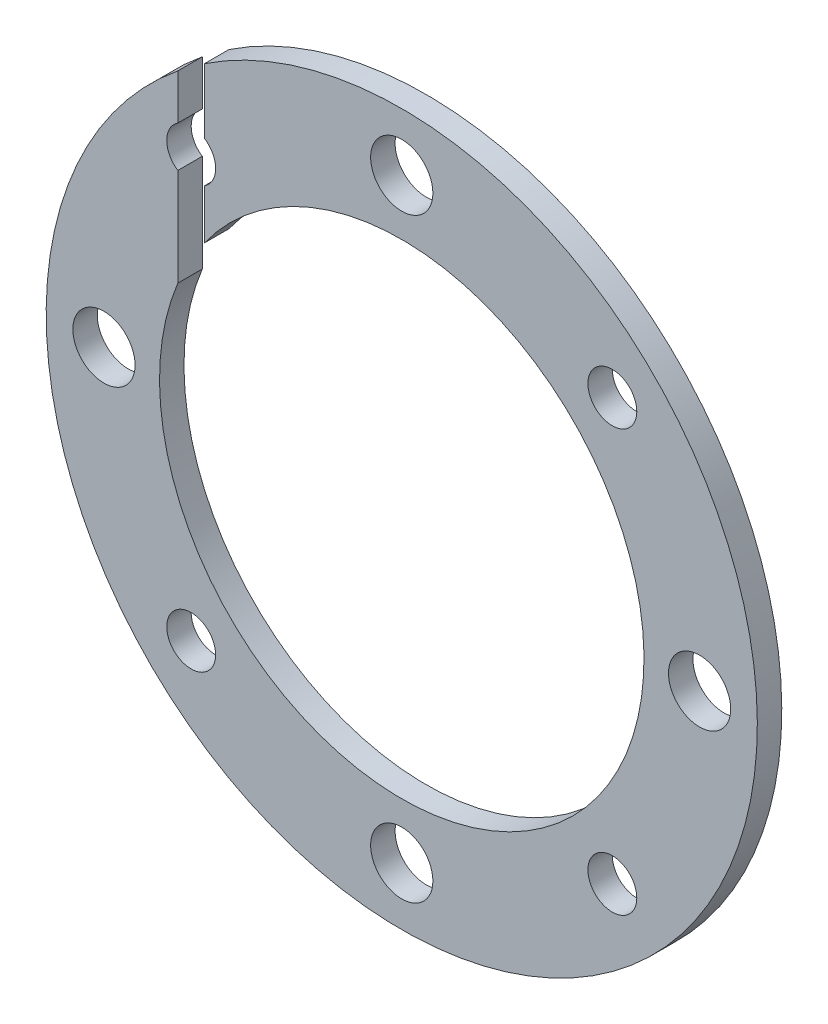
ISO-10303-21;
HEADER;
FILE_DESCRIPTION(('STEP AP214'),'2;1');
FILE_NAME('part.step','',(''),(''),'','','');
FILE_SCHEMA(('AUTOMOTIVE_DESIGN { 1 0 10303 214 1 1 1 1 }'));
ENDSEC;
DATA;
#1=APPLICATION_CONTEXT('core data for automotive mechanical design processes');
#2=APPLICATION_PROTOCOL_DEFINITION('international standard','automotive_design',2000,#1);
#3=PRODUCT_CONTEXT('',#1,'mechanical');
#4=PRODUCT('Part','Part','',(#3));
#5=PRODUCT_RELATED_PRODUCT_CATEGORY('part','',(#4));
#6=PRODUCT_DEFINITION_FORMATION('','',#4);
#7=PRODUCT_DEFINITION_CONTEXT('part definition',#1,'design');
#8=PRODUCT_DEFINITION('design','',#6,#7);
#9=PRODUCT_DEFINITION_SHAPE('','',#8);
#10=(LENGTH_UNIT() NAMED_UNIT(*) SI_UNIT(.MILLI.,.METRE.));
#11=(NAMED_UNIT(*) PLANE_ANGLE_UNIT() SI_UNIT($,.RADIAN.));
#12=(NAMED_UNIT(*) SI_UNIT($,.STERADIAN.) SOLID_ANGLE_UNIT());
#13=UNCERTAINTY_MEASURE_WITH_UNIT(LENGTH_MEASURE(1.E-05),#10,'distance_accuracy_value','');
#14=(GEOMETRIC_REPRESENTATION_CONTEXT(3) GLOBAL_UNCERTAINTY_ASSIGNED_CONTEXT((#13)) GLOBAL_UNIT_ASSIGNED_CONTEXT((#10,
#11,#12)) REPRESENTATION_CONTEXT('',''));
#15=CARTESIAN_POINT('',(0.,0.,0.));
#16=DIRECTION('',(0.,0.,1.));
#17=DIRECTION('',(1.,0.,0.));
#18=AXIS2_PLACEMENT_3D('',#15,#16,#17);
#19=CARTESIAN_POINT('',(-24.0670864044651,24.0670864044656,-2.794));
#20=DIRECTION('',(0.,0.,1.));
#21=DIRECTION('',(-1.,0.,0.));
#22=AXIS2_PLACEMENT_3D('',#19,#20,#21);
#23=CYLINDRICAL_SURFACE('',#22,2.794);
#24=DIRECTION('',(0.,0.,1.));
#25=VECTOR('',#24,1.);
#26=CARTESIAN_POINT('',(-25.5910864044651,26.408850696618,-2.794));
#27=LINE('',#26,#25);
#28=CARTESIAN_POINT('',(-25.5910864044651,26.408850696618,-2.794));
#29=VERTEX_POINT('',#28);
#30=CARTESIAN_POINT('',(-25.5910864044651,26.408850696618,0.));
#31=VERTEX_POINT('',#30);
#32=EDGE_CURVE('E141',#29,#31,#27,.T.);
#33=ORIENTED_EDGE('',*,*,#32,.T.);
#34=CARTESIAN_POINT('',(-24.0670864044651,24.0670864044656,0.));
#35=DIRECTION('',(0.,0.,1.));
#36=DIRECTION('',(1.,0.,0.));
#37=AXIS2_PLACEMENT_3D('',#34,#35,#36);
#38=CIRCLE('',#37,2.794);
#39=CARTESIAN_POINT('',(-25.5910864044651,21.7253221123132,0.));
#40=VERTEX_POINT('',#39);
#41=EDGE_CURVE('E176',#31,#40,#38,.T.);
#42=ORIENTED_EDGE('',*,*,#41,.T.);
#43=DIRECTION('',(0.,0.,1.));
#44=VECTOR('',#43,1.);
#45=CARTESIAN_POINT('',(-25.5910864044651,21.7253221123132,-2.794));
#46=LINE('',#45,#44);
#47=CARTESIAN_POINT('',(-25.5910864044651,21.7253221123132,-2.794));
#48=VERTEX_POINT('',#47);
#49=EDGE_CURVE('E138',#40,#48,#46,.F.);
#50=ORIENTED_EDGE('',*,*,#49,.T.);
#51=CARTESIAN_POINT('',(-24.0670864044651,24.0670864044656,-2.794));
#52=DIRECTION('',(0.,0.,1.));
#53=DIRECTION('',(1.,0.,0.));
#54=AXIS2_PLACEMENT_3D('',#51,#52,#53);
#55=CIRCLE('',#54,2.794);
#56=EDGE_CURVE('E150',#29,#48,#55,.T.);
#57=ORIENTED_EDGE('',*,*,#56,.F.);
#58=EDGE_LOOP('',(#33,#42,#50,#57));
#59=FACE_BOUND('',#58,.T.);
#60=ADVANCED_FACE('F39',(#59),#23,.F.);
#61=CARTESIAN_POINT('',(0.,0.,-2.794));
#62=DIRECTION('',(0.,0.,1.));
#63=DIRECTION('',(-1.,0.,0.));
#64=AXIS2_PLACEMENT_3D('',#61,#62,#63);
#65=CYLINDRICAL_SURFACE('',#64,40.64);
#66=CARTESIAN_POINT('',(0.,0.,-2.794));
#67=DIRECTION('',(0.,0.,1.));
#68=DIRECTION('',(1.,0.,0.));
#69=AXIS2_PLACEMENT_3D('',#66,#67,#68);
#70=CIRCLE('',#69,40.64);
#71=CARTESIAN_POINT('',(-25.5910864044651,31.5706492907448,-2.794));
#72=VERTEX_POINT('',#71);
#73=CARTESIAN_POINT('',(-22.5430864044651,33.8144770085362,-2.794));
#74=VERTEX_POINT('',#73);
#75=EDGE_CURVE('E126',#72,#74,#70,.T.);
#76=ORIENTED_EDGE('',*,*,#75,.T.);
#77=DIRECTION('',(0.,0.,1.));
#78=VECTOR('',#77,1.);
#79=CARTESIAN_POINT('',(-22.5430864044651,33.8144770085362,-2.794));
#80=LINE('',#79,#78);
#81=CARTESIAN_POINT('',(-22.5430864044651,33.8144770085362,0.));
#82=VERTEX_POINT('',#81);
#83=EDGE_CURVE('E130',#82,#74,#80,.F.);
#84=ORIENTED_EDGE('',*,*,#83,.F.);
#85=CARTESIAN_POINT('',(0.,0.,0.));
#86=DIRECTION('',(0.,0.,1.));
#87=DIRECTION('',(1.,0.,0.));
#88=AXIS2_PLACEMENT_3D('',#85,#86,#87);
#89=CIRCLE('',#88,40.64);
#90=CARTESIAN_POINT('',(-25.5910864044651,31.5706492907448,0.));
#91=VERTEX_POINT('',#90);
#92=EDGE_CURVE('E198',#91,#82,#89,.T.);
#93=ORIENTED_EDGE('',*,*,#92,.F.);
#94=DIRECTION('',(0.,0.,1.));
#95=VECTOR('',#94,1.);
#96=CARTESIAN_POINT('',(-25.5910864044651,31.5706492907448,-2.794));
#97=LINE('',#96,#95);
#98=EDGE_CURVE('E144',#72,#91,#97,.T.);
#99=ORIENTED_EDGE('',*,*,#98,.F.);
#100=EDGE_LOOP('',(#76,#84,#93,#99));
#101=FACE_BOUND('',#100,.T.);
#102=ADVANCED_FACE('F213',(#101),#65,.T.);
#103=CARTESIAN_POINT('',(-34.036,3.56508176546595E-13,-2.794));
#104=DIRECTION('',(0.,0.,1.));
#105=DIRECTION('',(-1.,0.,0.));
#106=AXIS2_PLACEMENT_3D('',#103,#104,#105);
#107=CYLINDRICAL_SURFACE('',#106,3.556);
#108=CARTESIAN_POINT('',(-34.036,3.56508176546595E-13,-2.794));
#109=DIRECTION('',(0.,0.,1.));
#110=DIRECTION('',(1.,0.,0.));
#111=AXIS2_PLACEMENT_3D('',#108,#109,#110);
#112=CIRCLE('',#111,3.556);
#113=CARTESIAN_POINT('',(-30.48,3.56508176546595E-13,-2.794));
#114=VERTEX_POINT('',#113);
#115=EDGE_CURVE('E169',#114,#114,#112,.T.);
#116=ORIENTED_EDGE('',*,*,#115,.F.);
#117=EDGE_LOOP('',(#116));
#118=FACE_BOUND('',#117,.T.);
#119=CARTESIAN_POINT('',(-34.036,3.56508176546595E-13,0.));
#120=DIRECTION('',(0.,0.,1.));
#121=DIRECTION('',(1.,0.,0.));
#122=AXIS2_PLACEMENT_3D('',#119,#120,#121);
#123=CIRCLE('',#122,3.556);
#124=CARTESIAN_POINT('',(-30.48,3.56508176546595E-13,0.));
#125=VERTEX_POINT('',#124);
#126=EDGE_CURVE('E195',#125,#125,#123,.T.);
#127=ORIENTED_EDGE('',*,*,#126,.T.);
#128=EDGE_LOOP('',(#127));
#129=FACE_BOUND('',#128,.T.);
#130=ADVANCED_FACE('F235',(#118,#129),#107,.F.);
#131=CARTESIAN_POINT('',(-24.0670864044655,-24.0670864044652,-2.794));
#132=DIRECTION('',(0.,0.,1.));
#133=DIRECTION('',(-1.,0.,0.));
#134=AXIS2_PLACEMENT_3D('',#131,#132,#133);
#135=CYLINDRICAL_SURFACE('',#134,2.794);
#136=CARTESIAN_POINT('',(-24.0670864044655,-24.0670864044652,-2.794));
#137=DIRECTION('',(0.,0.,1.));
#138=DIRECTION('',(1.,0.,0.));
#139=AXIS2_PLACEMENT_3D('',#136,#137,#138);
#140=CIRCLE('',#139,2.794);
#141=CARTESIAN_POINT('',(-21.2730864044655,-24.0670864044652,-2.794));
#142=VERTEX_POINT('',#141);
#143=EDGE_CURVE('E166',#142,#142,#140,.T.);
#144=ORIENTED_EDGE('',*,*,#143,.F.);
#145=EDGE_LOOP('',(#144));
#146=FACE_BOUND('',#145,.T.);
#147=CARTESIAN_POINT('',(-24.0670864044655,-24.0670864044652,0.));
#148=DIRECTION('',(0.,0.,1.));
#149=DIRECTION('',(1.,0.,0.));
#150=AXIS2_PLACEMENT_3D('',#147,#148,#149);
#151=CIRCLE('',#150,2.794);
#152=CARTESIAN_POINT('',(-21.2730864044655,-24.0670864044652,0.));
#153=VERTEX_POINT('',#152);
#154=EDGE_CURVE('E192',#153,#153,#151,.T.);
#155=ORIENTED_EDGE('',*,*,#154,.T.);
#156=EDGE_LOOP('',(#155));
#157=FACE_BOUND('',#156,.T.);
#158=ADVANCED_FACE('F265',(#146,#157),#135,.F.);
#159=CARTESIAN_POINT('',(-2.3767211769773E-13,-34.036,-2.794));
#160=DIRECTION('',(0.,0.,1.));
#161=DIRECTION('',(-1.,0.,0.));
#162=AXIS2_PLACEMENT_3D('',#159,#160,#161);
#163=CYLINDRICAL_SURFACE('',#162,3.556);
#164=CARTESIAN_POINT('',(-2.3767211769773E-13,-34.036,-2.794));
#165=DIRECTION('',(0.,0.,1.));
#166=DIRECTION('',(1.,0.,0.));
#167=AXIS2_PLACEMENT_3D('',#164,#165,#166);
#168=CIRCLE('',#167,3.556);
#169=CARTESIAN_POINT('',(3.55599999999976,-34.036,-2.794));
#170=VERTEX_POINT('',#169);
#171=EDGE_CURVE('E163',#170,#170,#168,.T.);
#172=ORIENTED_EDGE('',*,*,#171,.F.);
#173=EDGE_LOOP('',(#172));
#174=FACE_BOUND('',#173,.T.);
#175=CARTESIAN_POINT('',(-2.3767211769773E-13,-34.036,0.));
#176=DIRECTION('',(0.,0.,1.));
#177=DIRECTION('',(1.,0.,0.));
#178=AXIS2_PLACEMENT_3D('',#175,#176,#177);
#179=CIRCLE('',#178,3.556);
#180=CARTESIAN_POINT('',(3.55599999999976,-34.036,0.));
#181=VERTEX_POINT('',#180);
#182=EDGE_CURVE('E189',#181,#181,#179,.T.);
#183=ORIENTED_EDGE('',*,*,#182,.T.);
#184=EDGE_LOOP('',(#183));
#185=FACE_BOUND('',#184,.T.);
#186=ADVANCED_FACE('F261',(#174,#185),#163,.F.);
#187=CARTESIAN_POINT('',(24.0670864044652,-24.0670864044654,-2.794));
#188=DIRECTION('',(0.,0.,1.));
#189=DIRECTION('',(-1.,0.,0.));
#190=AXIS2_PLACEMENT_3D('',#187,#188,#189);
#191=CYLINDRICAL_SURFACE('',#190,2.794);
#192=CARTESIAN_POINT('',(24.0670864044652,-24.0670864044654,-2.794));
#193=DIRECTION('',(0.,0.,1.));
#194=DIRECTION('',(1.,0.,0.));
#195=AXIS2_PLACEMENT_3D('',#192,#193,#194);
#196=CIRCLE('',#195,2.794);
#197=CARTESIAN_POINT('',(26.8610864044652,-24.0670864044654,-2.794));
#198=VERTEX_POINT('',#197);
#199=EDGE_CURVE('E160',#198,#198,#196,.T.);
#200=ORIENTED_EDGE('',*,*,#199,.F.);
#201=EDGE_LOOP('',(#200));
#202=FACE_BOUND('',#201,.T.);
#203=CARTESIAN_POINT('',(24.0670864044652,-24.0670864044654,0.));
#204=DIRECTION('',(0.,0.,1.));
#205=DIRECTION('',(1.,0.,0.));
#206=AXIS2_PLACEMENT_3D('',#203,#204,#205);
#207=CIRCLE('',#206,2.794);
#208=CARTESIAN_POINT('',(26.8610864044652,-24.0670864044654,0.));
#209=VERTEX_POINT('',#208);
#210=EDGE_CURVE('E186',#209,#209,#207,.T.);
#211=ORIENTED_EDGE('',*,*,#210,.T.);
#212=EDGE_LOOP('',(#211));
#213=FACE_BOUND('',#212,.T.);
#214=ADVANCED_FACE('F257',(#202,#213),#191,.F.);
#215=CARTESIAN_POINT('',(34.036,-1.18836058848865E-13,-2.794));
#216=DIRECTION('',(0.,0.,1.));
#217=DIRECTION('',(-1.,0.,0.));
#218=AXIS2_PLACEMENT_3D('',#215,#216,#217);
#219=CYLINDRICAL_SURFACE('',#218,3.556);
#220=CARTESIAN_POINT('',(34.036,-1.18836058848865E-13,-2.794));
#221=DIRECTION('',(0.,0.,1.));
#222=DIRECTION('',(1.,0.,0.));
#223=AXIS2_PLACEMENT_3D('',#220,#221,#222);
#224=CIRCLE('',#223,3.556);
#225=CARTESIAN_POINT('',(37.592,-1.18836058848865E-13,-2.794));
#226=VERTEX_POINT('',#225);
#227=EDGE_CURVE('E157',#226,#226,#224,.T.);
#228=ORIENTED_EDGE('',*,*,#227,.F.);
#229=EDGE_LOOP('',(#228));
#230=FACE_BOUND('',#229,.T.);
#231=CARTESIAN_POINT('',(34.036,-1.18836058848865E-13,0.));
#232=DIRECTION('',(0.,0.,1.));
#233=DIRECTION('',(1.,0.,0.));
#234=AXIS2_PLACEMENT_3D('',#231,#232,#233);
#235=CIRCLE('',#234,3.556);
#236=CARTESIAN_POINT('',(37.592,-1.18836058848865E-13,0.));
#237=VERTEX_POINT('',#236);
#238=EDGE_CURVE('E183',#237,#237,#235,.T.);
#239=ORIENTED_EDGE('',*,*,#238,.T.);
#240=EDGE_LOOP('',(#239));
#241=FACE_BOUND('',#240,.T.);
#242=ADVANCED_FACE('F249',(#230,#241),#219,.F.);
#243=CARTESIAN_POINT('',(24.0670864044653,24.0670864044653,-2.794));
#244=DIRECTION('',(0.,0.,1.));
#245=DIRECTION('',(-1.,0.,0.));
#246=AXIS2_PLACEMENT_3D('',#243,#244,#245);
#247=CYLINDRICAL_SURFACE('',#246,2.794);
#248=CARTESIAN_POINT('',(24.0670864044653,24.0670864044653,-2.794));
#249=DIRECTION('',(0.,0.,1.));
#250=DIRECTION('',(1.,0.,0.));
#251=AXIS2_PLACEMENT_3D('',#248,#249,#250);
#252=CIRCLE('',#251,2.794);
#253=CARTESIAN_POINT('',(26.8610864044653,24.0670864044653,-2.794));
#254=VERTEX_POINT('',#253);
#255=EDGE_CURVE('E154',#254,#254,#252,.T.);
#256=ORIENTED_EDGE('',*,*,#255,.F.);
#257=EDGE_LOOP('',(#256));
#258=FACE_BOUND('',#257,.T.);
#259=CARTESIAN_POINT('',(24.0670864044653,24.0670864044653,0.));
#260=DIRECTION('',(0.,0.,1.));
#261=DIRECTION('',(1.,0.,0.));
#262=AXIS2_PLACEMENT_3D('',#259,#260,#261);
#263=CIRCLE('',#262,2.794);
#264=CARTESIAN_POINT('',(26.8610864044653,24.0670864044653,0.));
#265=VERTEX_POINT('',#264);
#266=EDGE_CURVE('E180',#265,#265,#263,.T.);
#267=ORIENTED_EDGE('',*,*,#266,.T.);
#268=EDGE_LOOP('',(#267));
#269=FACE_BOUND('',#268,.T.);
#270=ADVANCED_FACE('F244',(#258,#269),#247,.F.);
#271=CARTESIAN_POINT('',(0.,34.036,-2.794));
#272=DIRECTION('',(0.,0.,1.));
#273=DIRECTION('',(-1.,0.,0.));
#274=AXIS2_PLACEMENT_3D('',#271,#272,#273);
#275=CYLINDRICAL_SURFACE('',#274,3.556);
#276=CARTESIAN_POINT('',(0.,34.036,-2.794));
#277=DIRECTION('',(0.,0.,1.));
#278=DIRECTION('',(1.,0.,0.));
#279=AXIS2_PLACEMENT_3D('',#276,#277,#278);
#280=CIRCLE('',#279,3.556);
#281=CARTESIAN_POINT('',(3.556,34.036,-2.794));
#282=VERTEX_POINT('',#281);
#283=EDGE_CURVE('E151',#282,#282,#280,.T.);
#284=ORIENTED_EDGE('',*,*,#283,.F.);
#285=EDGE_LOOP('',(#284));
#286=FACE_BOUND('',#285,.T.);
#287=CARTESIAN_POINT('',(0.,34.036,0.));
#288=DIRECTION('',(0.,0.,1.));
#289=DIRECTION('',(1.,0.,0.));
#290=AXIS2_PLACEMENT_3D('',#287,#288,#289);
#291=CIRCLE('',#290,3.556);
#292=CARTESIAN_POINT('',(3.556,34.036,0.));
#293=VERTEX_POINT('',#292);
#294=EDGE_CURVE('E177',#293,#293,#291,.T.);
#295=ORIENTED_EDGE('',*,*,#294,.T.);
#296=EDGE_LOOP('',(#295));
#297=FACE_BOUND('',#296,.T.);
#298=ADVANCED_FACE('F238',(#286,#297),#275,.F.);
#299=DIRECTION('',(0.,0.,1.));
#300=VECTOR('',#299,1.);
#301=CARTESIAN_POINT('',(-22.5430864044651,21.7253221123132,-2.794));
#302=LINE('',#301,#300);
#303=CARTESIAN_POINT('',(-22.5430864044651,21.7253221123132,-2.794));
#304=VERTEX_POINT('',#303);
#305=CARTESIAN_POINT('',(-22.5430864044651,21.7253221123132,0.));
#306=VERTEX_POINT('',#305);
#307=EDGE_CURVE('E111',#304,#306,#302,.T.);
#308=ORIENTED_EDGE('',*,*,#307,.T.);
#309=CARTESIAN_POINT('',(-22.5430864044651,26.408850696618,0.));
#310=VERTEX_POINT('',#309);
#311=EDGE_CURVE('E147',#306,#310,#38,.T.);
#312=ORIENTED_EDGE('',*,*,#311,.T.);
#313=DIRECTION('',(0.,0.,1.));
#314=VECTOR('',#313,1.);
#315=CARTESIAN_POINT('',(-22.5430864044651,26.408850696618,-2.794));
#316=LINE('',#315,#314);
#317=CARTESIAN_POINT('',(-22.5430864044651,26.408850696618,-2.794));
#318=VERTEX_POINT('',#317);
#319=EDGE_CURVE('E115',#310,#318,#316,.F.);
#320=ORIENTED_EDGE('',*,*,#319,.T.);
#321=EDGE_CURVE('E148',#304,#318,#55,.T.);
#322=ORIENTED_EDGE('',*,*,#321,.F.);
#323=EDGE_LOOP('',(#308,#312,#320,#322));
#324=FACE_BOUND('',#323,.T.);
#325=ADVANCED_FACE('F41',(#324),#23,.F.);
#326=CARTESIAN_POINT('',(0.,0.,-2.794));
#327=DIRECTION('',(0.,0.,1.));
#328=DIRECTION('',(-1.,0.,0.));
#329=AXIS2_PLACEMENT_3D('',#326,#327,#328);
#330=CYLINDRICAL_SURFACE('',#329,27.686);
#331=DIRECTION('',(0.,0.,1.));
#332=VECTOR('',#331,1.);
#333=CARTESIAN_POINT('',(-25.5910864044651,10.5646056546945,-2.794));
#334=LINE('',#333,#332);
#335=CARTESIAN_POINT('',(-25.5910864044651,10.5646056546945,-2.794));
#336=VERTEX_POINT('',#335);
#337=CARTESIAN_POINT('',(-25.5910864044651,10.5646056546945,0.));
#338=VERTEX_POINT('',#337);
#339=EDGE_CURVE('E132',#336,#338,#334,.T.);
#340=ORIENTED_EDGE('',*,*,#339,.T.);
#341=CARTESIAN_POINT('',(0.,0.,0.));
#342=DIRECTION('',(0.,0.,1.));
#343=DIRECTION('',(1.,0.,0.));
#344=AXIS2_PLACEMENT_3D('',#341,#342,#343);
#345=CIRCLE('',#344,27.686);
#346=CARTESIAN_POINT('',(-22.5430864044651,16.0724562951909,0.));
#347=VERTEX_POINT('',#346);
#348=EDGE_CURVE('E129',#338,#347,#345,.T.);
#349=ORIENTED_EDGE('',*,*,#348,.T.);
#350=DIRECTION('',(0.,0.,1.));
#351=VECTOR('',#350,1.);
#352=CARTESIAN_POINT('',(-22.5430864044651,16.0724562951909,-2.794));
#353=LINE('',#352,#351);
#354=CARTESIAN_POINT('',(-22.5430864044651,16.0724562951909,-2.794));
#355=VERTEX_POINT('',#354);
#356=EDGE_CURVE('E108',#347,#355,#353,.F.);
#357=ORIENTED_EDGE('',*,*,#356,.T.);
#358=CARTESIAN_POINT('',(0.,0.,-2.794));
#359=DIRECTION('',(0.,0.,1.));
#360=DIRECTION('',(1.,0.,0.));
#361=AXIS2_PLACEMENT_3D('',#358,#359,#360);
#362=CIRCLE('',#361,27.686);
#363=EDGE_CURVE('E119',#336,#355,#362,.T.);
#364=ORIENTED_EDGE('',*,*,#363,.F.);
#365=EDGE_LOOP('',(#340,#349,#357,#364));
#366=FACE_BOUND('',#365,.T.);
#367=ADVANCED_FACE('F128',(#366),#330,.F.);
#368=CARTESIAN_POINT('',(0.,0.,-2.794));
#369=DIRECTION('',(0.,0.,-1.));
#370=DIRECTION('',(1.,0.,0.));
#371=AXIS2_PLACEMENT_3D('',#368,#369,#370);
#372=PLANE('',#371);
#373=DIRECTION('',(0.,-1.,0.));
#374=VECTOR('',#373,1.);
#375=CARTESIAN_POINT('',(-25.5910864044651,48.1341728089311,-2.794));
#376=LINE('',#375,#374);
#377=EDGE_CURVE('E207',#72,#29,#376,.T.);
#378=ORIENTED_EDGE('',*,*,#377,.T.);
#379=ORIENTED_EDGE('',*,*,#56,.T.);
#380=EDGE_CURVE('E123',#48,#336,#376,.T.);
#381=ORIENTED_EDGE('',*,*,#380,.T.);
#382=ORIENTED_EDGE('',*,*,#363,.T.);
#383=DIRECTION('',(0.,1.,0.));
#384=VECTOR('',#383,1.);
#385=CARTESIAN_POINT('',(-22.5430864044651,48.1341728089311,-2.794));
#386=LINE('',#385,#384);
#387=EDGE_CURVE('E104',#355,#304,#386,.T.);
#388=ORIENTED_EDGE('',*,*,#387,.T.);
#389=ORIENTED_EDGE('',*,*,#321,.T.);
#390=EDGE_CURVE('E116',#318,#74,#386,.T.);
#391=ORIENTED_EDGE('',*,*,#390,.T.);
#392=ORIENTED_EDGE('',*,*,#75,.F.);
#393=EDGE_LOOP('',(#378,#379,#381,#382,#388,#389,#391,#392));
#394=FACE_BOUND('',#393,.T.);
#395=ORIENTED_EDGE('',*,*,#283,.T.);
#396=EDGE_LOOP('',(#395));
#397=FACE_BOUND('',#396,.T.);
#398=ORIENTED_EDGE('',*,*,#255,.T.);
#399=EDGE_LOOP('',(#398));
#400=FACE_BOUND('',#399,.T.);
#401=ORIENTED_EDGE('',*,*,#227,.T.);
#402=EDGE_LOOP('',(#401));
#403=FACE_BOUND('',#402,.T.);
#404=ORIENTED_EDGE('',*,*,#199,.T.);
#405=EDGE_LOOP('',(#404));
#406=FACE_BOUND('',#405,.T.);
#407=ORIENTED_EDGE('',*,*,#171,.T.);
#408=EDGE_LOOP('',(#407));
#409=FACE_BOUND('',#408,.T.);
#410=ORIENTED_EDGE('',*,*,#143,.T.);
#411=EDGE_LOOP('',(#410));
#412=FACE_BOUND('',#411,.T.);
#413=ORIENTED_EDGE('',*,*,#115,.T.);
#414=EDGE_LOOP('',(#413));
#415=FACE_BOUND('',#414,.T.);
#416=ADVANCED_FACE('F120',(#394,#397,#400,#403,#406,#409,#412,#415),#372,.T.);
#417=CARTESIAN_POINT('',(0.,0.,0.));
#418=DIRECTION('',(0.,0.,-1.));
#419=DIRECTION('',(1.,0.,0.));
#420=AXIS2_PLACEMENT_3D('',#417,#418,#419);
#421=PLANE('',#420);
#422=ORIENTED_EDGE('',*,*,#294,.F.);
#423=EDGE_LOOP('',(#422));
#424=FACE_BOUND('',#423,.T.);
#425=ORIENTED_EDGE('',*,*,#266,.F.);
#426=EDGE_LOOP('',(#425));
#427=FACE_BOUND('',#426,.T.);
#428=ORIENTED_EDGE('',*,*,#238,.F.);
#429=EDGE_LOOP('',(#428));
#430=FACE_BOUND('',#429,.T.);
#431=ORIENTED_EDGE('',*,*,#210,.F.);
#432=EDGE_LOOP('',(#431));
#433=FACE_BOUND('',#432,.T.);
#434=ORIENTED_EDGE('',*,*,#182,.F.);
#435=EDGE_LOOP('',(#434));
#436=FACE_BOUND('',#435,.T.);
#437=ORIENTED_EDGE('',*,*,#154,.F.);
#438=EDGE_LOOP('',(#437));
#439=FACE_BOUND('',#438,.T.);
#440=ORIENTED_EDGE('',*,*,#126,.F.);
#441=EDGE_LOOP('',(#440));
#442=FACE_BOUND('',#441,.T.);
#443=ORIENTED_EDGE('',*,*,#92,.T.);
#444=DIRECTION('',(0.,1.,0.));
#445=VECTOR('',#444,1.);
#446=CARTESIAN_POINT('',(-22.5430864044651,0.,0.));
#447=LINE('',#446,#445);
#448=EDGE_CURVE('E61',#310,#82,#447,.T.);
#449=ORIENTED_EDGE('',*,*,#448,.F.);
#450=ORIENTED_EDGE('',*,*,#311,.F.);
#451=EDGE_CURVE('E200',#347,#306,#447,.T.);
#452=ORIENTED_EDGE('',*,*,#451,.F.);
#453=ORIENTED_EDGE('',*,*,#348,.F.);
#454=DIRECTION('',(0.,-1.,0.));
#455=VECTOR('',#454,1.);
#456=CARTESIAN_POINT('',(-25.5910864044651,0.,0.));
#457=LINE('',#456,#455);
#458=EDGE_CURVE('E43',#40,#338,#457,.T.);
#459=ORIENTED_EDGE('',*,*,#458,.F.);
#460=ORIENTED_EDGE('',*,*,#41,.F.);
#461=EDGE_CURVE('E11',#91,#31,#457,.T.);
#462=ORIENTED_EDGE('',*,*,#461,.F.);
#463=EDGE_LOOP('',(#443,#449,#450,#452,#453,#459,#460,#462));
#464=FACE_BOUND('',#463,.T.);
#465=ADVANCED_FACE('F203',(#424,#427,#430,#433,#436,#439,#442,#464),#421,.F.);
#466=CARTESIAN_POINT('',(-22.5430864044651,48.1341728089311,11.303));
#467=DIRECTION('',(1.,0.,0.));
#468=DIRECTION('',(0.,1.,0.));
#469=AXIS2_PLACEMENT_3D('',#466,#467,#468);
#470=PLANE('',#469);
#471=ORIENTED_EDGE('',*,*,#448,.T.);
#472=ORIENTED_EDGE('',*,*,#83,.T.);
#473=ORIENTED_EDGE('',*,*,#390,.F.);
#474=ORIENTED_EDGE('',*,*,#319,.F.);
#475=EDGE_LOOP('',(#471,#472,#473,#474));
#476=FACE_BOUND('',#475,.T.);
#477=ADVANCED_FACE('F209',(#476),#470,.F.);
#478=ORIENTED_EDGE('',*,*,#307,.F.);
#479=ORIENTED_EDGE('',*,*,#387,.F.);
#480=ORIENTED_EDGE('',*,*,#356,.F.);
#481=ORIENTED_EDGE('',*,*,#451,.T.);
#482=EDGE_LOOP('',(#478,#479,#480,#481));
#483=FACE_BOUND('',#482,.T.);
#484=ADVANCED_FACE('F106',(#483),#470,.F.);
#485=CARTESIAN_POINT('',(-25.5910864044651,48.1341728089311,11.303));
#486=DIRECTION('',(-1.,0.,0.));
#487=DIRECTION('',(0.,-1.,0.));
#488=AXIS2_PLACEMENT_3D('',#485,#486,#487);
#489=PLANE('',#488);
#490=ORIENTED_EDGE('',*,*,#49,.F.);
#491=ORIENTED_EDGE('',*,*,#458,.T.);
#492=ORIENTED_EDGE('',*,*,#339,.F.);
#493=ORIENTED_EDGE('',*,*,#380,.F.);
#494=EDGE_LOOP('',(#490,#491,#492,#493));
#495=FACE_BOUND('',#494,.T.);
#496=ADVANCED_FACE('F222',(#495),#489,.F.);
#497=ORIENTED_EDGE('',*,*,#377,.F.);
#498=ORIENTED_EDGE('',*,*,#98,.T.);
#499=ORIENTED_EDGE('',*,*,#461,.T.);
#500=ORIENTED_EDGE('',*,*,#32,.F.);
#501=EDGE_LOOP('',(#497,#498,#499,#500));
#502=FACE_BOUND('',#501,.T.);
#503=ADVANCED_FACE('F215',(#502),#489,.F.);
#504=CLOSED_SHELL('',(#60,#102,#130,#158,#186,#214,#242,#270,#298,#325,#367,#416,#465,#477,#484,
#496,#503));
#505=MANIFOLD_SOLID_BREP('B2',#504);
#506=ADVANCED_BREP_SHAPE_REPRESENTATION('',(#18,#505),#14);
#507=SHAPE_DEFINITION_REPRESENTATION(#9,#506);
ENDSEC;
END-ISO-10303-21;
